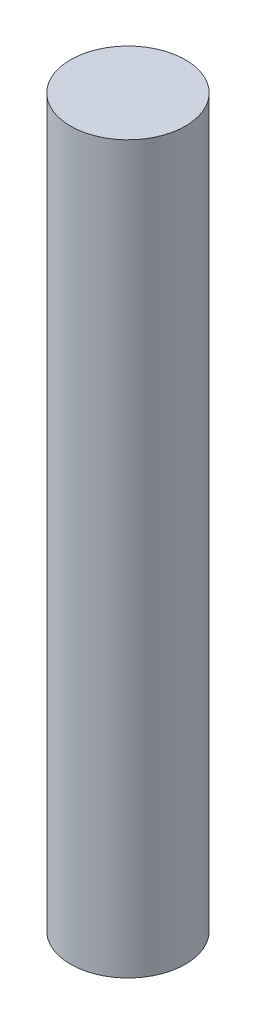
ISO-10303-21;
HEADER;
FILE_DESCRIPTION(('STEP AP214'),'2;1');
FILE_NAME('part.step','',(''),(''),'','','');
FILE_SCHEMA(('AUTOMOTIVE_DESIGN { 1 0 10303 214 1 1 1 1 }'));
ENDSEC;
DATA;
#1=APPLICATION_CONTEXT('core data for automotive mechanical design processes');
#2=APPLICATION_PROTOCOL_DEFINITION('international standard','automotive_design',2000,#1);
#3=PRODUCT_CONTEXT('',#1,'mechanical');
#4=PRODUCT('Part','Part','',(#3));
#5=PRODUCT_RELATED_PRODUCT_CATEGORY('part','',(#4));
#6=PRODUCT_DEFINITION_FORMATION('','',#4);
#7=PRODUCT_DEFINITION_CONTEXT('part definition',#1,'design');
#8=PRODUCT_DEFINITION('design','',#6,#7);
#9=PRODUCT_DEFINITION_SHAPE('','',#8);
#10=(LENGTH_UNIT() NAMED_UNIT(*) SI_UNIT(.MILLI.,.METRE.));
#11=(NAMED_UNIT(*) PLANE_ANGLE_UNIT() SI_UNIT($,.RADIAN.));
#12=(NAMED_UNIT(*) SI_UNIT($,.STERADIAN.) SOLID_ANGLE_UNIT());
#13=UNCERTAINTY_MEASURE_WITH_UNIT(LENGTH_MEASURE(1.E-05),#10,'distance_accuracy_value','');
#14=(GEOMETRIC_REPRESENTATION_CONTEXT(3) GLOBAL_UNCERTAINTY_ASSIGNED_CONTEXT((#13)) GLOBAL_UNIT_ASSIGNED_CONTEXT((#10,
#11,#12)) REPRESENTATION_CONTEXT('',''));
#15=CARTESIAN_POINT('',(0.,0.,0.));
#16=DIRECTION('',(0.,0.,1.));
#17=DIRECTION('',(1.,0.,0.));
#18=AXIS2_PLACEMENT_3D('',#15,#16,#17);
#19=CARTESIAN_POINT('',(0.,60.,0.));
#20=DIRECTION('',(0.,-1.,0.));
#21=DIRECTION('',(0.,0.,-1.));
#22=AXIS2_PLACEMENT_3D('',#19,#20,#21);
#23=CYLINDRICAL_SURFACE('',#22,4.75);
#24=CARTESIAN_POINT('',(0.,60.,0.));
#25=DIRECTION('',(0.,1.,0.));
#26=DIRECTION('',(0.,0.,1.));
#27=AXIS2_PLACEMENT_3D('',#24,#25,#26);
#28=CIRCLE('',#27,4.75);
#29=CARTESIAN_POINT('',(0.,60.,4.75));
#30=VERTEX_POINT('',#29);
#31=EDGE_CURVE('E10',#30,#30,#28,.T.);
#32=ORIENTED_EDGE('',*,*,#31,.F.);
#33=EDGE_LOOP('',(#32));
#34=FACE_BOUND('',#33,.T.);
#35=CARTESIAN_POINT('',(0.,0.,0.));
#36=DIRECTION('',(0.,1.,0.));
#37=DIRECTION('',(0.,0.,1.));
#38=AXIS2_PLACEMENT_3D('',#35,#36,#37);
#39=CIRCLE('',#38,4.75);
#40=CARTESIAN_POINT('',(0.,0.,4.75));
#41=VERTEX_POINT('',#40);
#42=EDGE_CURVE('E34',#41,#41,#39,.T.);
#43=ORIENTED_EDGE('',*,*,#42,.T.);
#44=EDGE_LOOP('',(#43));
#45=FACE_BOUND('',#44,.T.);
#46=ADVANCED_FACE('F31',(#34,#45),#23,.T.);
#47=CARTESIAN_POINT('',(0.,60.,0.));
#48=DIRECTION('',(0.,1.,0.));
#49=DIRECTION('',(0.,0.,1.));
#50=AXIS2_PLACEMENT_3D('',#47,#48,#49);
#51=PLANE('',#50);
#52=ORIENTED_EDGE('',*,*,#31,.T.);
#53=EDGE_LOOP('',(#52));
#54=FACE_BOUND('',#53,.T.);
#55=ADVANCED_FACE('F46',(#54),#51,.T.);
#56=CARTESIAN_POINT('',(0.,0.,0.));
#57=DIRECTION('',(0.,1.,0.));
#58=DIRECTION('',(0.,0.,1.));
#59=AXIS2_PLACEMENT_3D('',#56,#57,#58);
#60=PLANE('',#59);
#61=ORIENTED_EDGE('',*,*,#42,.F.);
#62=EDGE_LOOP('',(#61));
#63=FACE_BOUND('',#62,.T.);
#64=ADVANCED_FACE('F44',(#63),#60,.F.);
#65=CLOSED_SHELL('',(#46,#55,#64));
#66=MANIFOLD_SOLID_BREP('B2',#65);
#67=ADVANCED_BREP_SHAPE_REPRESENTATION('',(#18,#66),#14);
#68=SHAPE_DEFINITION_REPRESENTATION(#9,#67);
ENDSEC;
END-ISO-10303-21;
